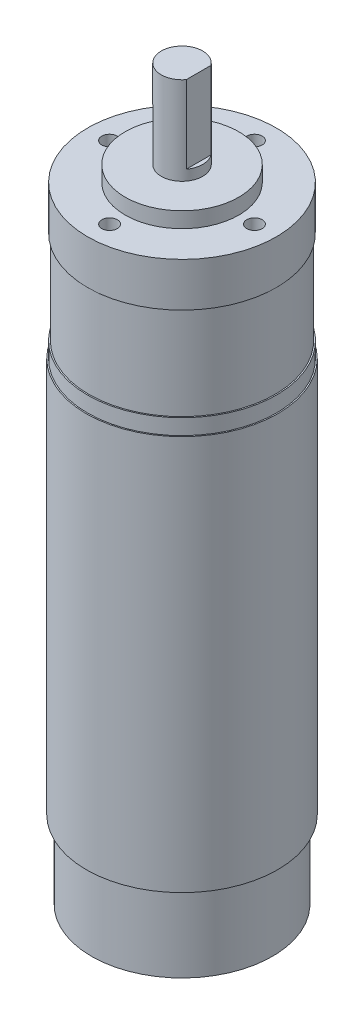
ISO-10303-21;
HEADER;
FILE_DESCRIPTION(('STEP AP214'),'2;1');
FILE_NAME('part.step','',(''),(''),'','','');
FILE_SCHEMA(('AUTOMOTIVE_DESIGN { 1 0 10303 214 1 1 1 1 }'));
ENDSEC;
DATA;
#1=APPLICATION_CONTEXT('core data for automotive mechanical design processes');
#2=APPLICATION_PROTOCOL_DEFINITION('international standard','automotive_design',2000,#1);
#3=PRODUCT_CONTEXT('',#1,'mechanical');
#4=PRODUCT('Part','Part','',(#3));
#5=PRODUCT_RELATED_PRODUCT_CATEGORY('part','',(#4));
#6=PRODUCT_DEFINITION_FORMATION('','',#4);
#7=PRODUCT_DEFINITION_CONTEXT('part definition',#1,'design');
#8=PRODUCT_DEFINITION('design','',#6,#7);
#9=PRODUCT_DEFINITION_SHAPE('','',#8);
#10=(LENGTH_UNIT() NAMED_UNIT(*) SI_UNIT(.MILLI.,.METRE.));
#11=(NAMED_UNIT(*) PLANE_ANGLE_UNIT() SI_UNIT($,.RADIAN.));
#12=(NAMED_UNIT(*) SI_UNIT($,.STERADIAN.) SOLID_ANGLE_UNIT());
#13=UNCERTAINTY_MEASURE_WITH_UNIT(LENGTH_MEASURE(1.E-05),#10,'distance_accuracy_value','');
#14=(GEOMETRIC_REPRESENTATION_CONTEXT(3) GLOBAL_UNCERTAINTY_ASSIGNED_CONTEXT((#13)) GLOBAL_UNIT_ASSIGNED_CONTEXT((#10,
#11,#12)) REPRESENTATION_CONTEXT('',''));
#15=CARTESIAN_POINT('',(0.,0.,0.));
#16=DIRECTION('',(0.,0.,1.));
#17=DIRECTION('',(1.,0.,0.));
#18=AXIS2_PLACEMENT_3D('',#15,#16,#17);
#19=CARTESIAN_POINT('',(0.,123.839,0.));
#20=DIRECTION('',(0.,1.,0.));
#21=DIRECTION('',(0.,0.,1.));
#22=AXIS2_PLACEMENT_3D('',#19,#20,#21);
#23=PLANE('',#22);
#24=CARTESIAN_POINT('',(0.,123.839,0.));
#25=DIRECTION('',(0.,1.,0.));
#26=DIRECTION('',(0.,0.,1.));
#27=AXIS2_PLACEMENT_3D('',#24,#25,#26);
#28=CIRCLE('',#27,10.977);
#29=CARTESIAN_POINT('',(0.,123.839,10.977));
#30=VERTEX_POINT('',#29);
#31=EDGE_CURVE('E74',#30,#30,#28,.T.);
#32=ORIENTED_EDGE('',*,*,#31,.T.);
#33=EDGE_LOOP('',(#32));
#34=FACE_BOUND('',#33,.T.);
#35=CARTESIAN_POINT('',(0.,123.839,0.));
#36=DIRECTION('',(0.,1.,0.));
#37=DIRECTION('',(0.,0.,1.));
#38=AXIS2_PLACEMENT_3D('',#35,#36,#37);
#39=CIRCLE('',#38,4.);
#40=CARTESIAN_POINT('',(0.,123.839,4.));
#41=VERTEX_POINT('',#40);
#42=EDGE_CURVE('E71',#41,#41,#39,.T.);
#43=ORIENTED_EDGE('',*,*,#42,.F.);
#44=EDGE_LOOP('',(#43));
#45=FACE_BOUND('',#44,.T.);
#46=ADVANCED_FACE('F32',(#34,#45),#23,.T.);
#47=CARTESIAN_POINT('',(0.,120.839,0.));
#48=DIRECTION('',(0.,1.,0.));
#49=DIRECTION('',(0.,0.,1.));
#50=AXIS2_PLACEMENT_3D('',#47,#48,#49);
#51=PLANE('',#50);
#52=CARTESIAN_POINT('',(-13.9989999999998,120.839,0.00100000000004344));
#53=DIRECTION('',(0.,1.,0.));
#54=DIRECTION('',(0.,0.,1.));
#55=AXIS2_PLACEMENT_3D('',#52,#53,#54);
#56=CIRCLE('',#55,1.5);
#57=CARTESIAN_POINT('',(-13.9989999999998,120.839,1.50100000000004));
#58=VERTEX_POINT('',#57);
#59=EDGE_CURVE('E365',#58,#58,#56,.T.);
#60=ORIENTED_EDGE('',*,*,#59,.F.);
#61=EDGE_LOOP('',(#60));
#62=FACE_BOUND('',#61,.T.);
#63=CARTESIAN_POINT('',(0.00200000000028109,120.839,14.));
#64=DIRECTION('',(0.,1.,0.));
#65=DIRECTION('',(0.,0.,1.));
#66=AXIS2_PLACEMENT_3D('',#63,#64,#65);
#67=CIRCLE('',#66,1.5);
#68=CARTESIAN_POINT('',(0.00200000000028109,120.839,15.5));
#69=VERTEX_POINT('',#68);
#70=EDGE_CURVE('E364',#69,#69,#67,.T.);
#71=ORIENTED_EDGE('',*,*,#70,.F.);
#72=EDGE_LOOP('',(#71));
#73=FACE_BOUND('',#72,.T.);
#74=CARTESIAN_POINT('',(14.0010000000002,120.839,-0.00100000000013947));
#75=DIRECTION('',(0.,1.,0.));
#76=DIRECTION('',(0.,0.,1.));
#77=AXIS2_PLACEMENT_3D('',#74,#75,#76);
#78=CIRCLE('',#77,1.5);
#79=CARTESIAN_POINT('',(14.0010000000002,120.839,1.49899999999986));
#80=VERTEX_POINT('',#79);
#81=EDGE_CURVE('E374',#80,#80,#78,.T.);
#82=ORIENTED_EDGE('',*,*,#81,.F.);
#83=EDGE_LOOP('',(#82));
#84=FACE_BOUND('',#83,.T.);
#85=CARTESIAN_POINT('',(0.,120.839,-14.));
#86=DIRECTION('',(0.,1.,0.));
#87=DIRECTION('',(0.,0.,1.));
#88=AXIS2_PLACEMENT_3D('',#85,#86,#87);
#89=CIRCLE('',#88,1.5);
#90=CARTESIAN_POINT('',(0.,120.839,-12.5));
#91=VERTEX_POINT('',#90);
#92=EDGE_CURVE('E379',#91,#91,#89,.T.);
#93=ORIENTED_EDGE('',*,*,#92,.F.);
#94=EDGE_LOOP('',(#93));
#95=FACE_BOUND('',#94,.T.);
#96=CARTESIAN_POINT('',(0.,120.839,0.));
#97=DIRECTION('',(0.,1.,0.));
#98=DIRECTION('',(0.,0.,1.));
#99=AXIS2_PLACEMENT_3D('',#96,#97,#98);
#100=CIRCLE('',#99,18.241);
#101=CARTESIAN_POINT('',(0.,120.839,18.241));
#102=VERTEX_POINT('',#101);
#103=EDGE_CURVE('E83',#102,#102,#100,.T.);
#104=ORIENTED_EDGE('',*,*,#103,.T.);
#105=EDGE_LOOP('',(#104));
#106=FACE_BOUND('',#105,.T.);
#107=CARTESIAN_POINT('',(0.,120.839,0.));
#108=DIRECTION('',(0.,1.,0.));
#109=DIRECTION('',(0.,0.,1.));
#110=AXIS2_PLACEMENT_3D('',#107,#108,#109);
#111=CIRCLE('',#110,10.977);
#112=CARTESIAN_POINT('',(0.,120.839,10.977));
#113=VERTEX_POINT('',#112);
#114=EDGE_CURVE('E70',#113,#113,#111,.T.);
#115=ORIENTED_EDGE('',*,*,#114,.F.);
#116=EDGE_LOOP('',(#115));
#117=FACE_BOUND('',#116,.T.);
#118=ADVANCED_FACE('F127',(#62,#73,#84,#95,#106,#117),#51,.T.);
#119=CARTESIAN_POINT('',(0.,94.339,0.));
#120=DIRECTION('',(0.,1.,0.));
#121=DIRECTION('',(0.,0.,1.));
#122=AXIS2_PLACEMENT_3D('',#119,#120,#121);
#123=PLANE('',#122);
#124=CARTESIAN_POINT('',(0.,94.339,0.));
#125=DIRECTION('',(0.,1.,0.));
#126=DIRECTION('',(0.,0.,1.));
#127=AXIS2_PLACEMENT_3D('',#124,#125,#126);
#128=CIRCLE('',#127,18.25);
#129=CARTESIAN_POINT('',(0.,94.339,18.25));
#130=VERTEX_POINT('',#129);
#131=EDGE_CURVE('E95',#130,#130,#128,.T.);
#132=ORIENTED_EDGE('',*,*,#131,.T.);
#133=EDGE_LOOP('',(#132));
#134=FACE_BOUND('',#133,.T.);
#135=CARTESIAN_POINT('',(0.,94.339,0.));
#136=DIRECTION('',(0.,1.,0.));
#137=DIRECTION('',(0.,0.,1.));
#138=AXIS2_PLACEMENT_3D('',#135,#136,#137);
#139=CIRCLE('',#138,18.);
#140=CARTESIAN_POINT('',(0.,94.339,18.));
#141=VERTEX_POINT('',#140);
#142=EDGE_CURVE('E86',#141,#141,#139,.T.);
#143=ORIENTED_EDGE('',*,*,#142,.F.);
#144=EDGE_LOOP('',(#143));
#145=FACE_BOUND('',#144,.T.);
#146=ADVANCED_FACE('F133',(#134,#145),#123,.T.);
#147=CARTESIAN_POINT('',(0.,91.339,0.));
#148=DIRECTION('',(0.,1.,0.));
#149=DIRECTION('',(0.,0.,1.));
#150=AXIS2_PLACEMENT_3D('',#147,#148,#149);
#151=PLANE('',#150);
#152=CARTESIAN_POINT('',(0.,91.339,0.));
#153=DIRECTION('',(0.,1.,0.));
#154=DIRECTION('',(0.,0.,1.));
#155=AXIS2_PLACEMENT_3D('',#152,#153,#154);
#156=CIRCLE('',#155,18.491);
#157=CARTESIAN_POINT('',(0.,91.339,18.491));
#158=VERTEX_POINT('',#157);
#159=EDGE_CURVE('E101',#158,#158,#156,.T.);
#160=ORIENTED_EDGE('',*,*,#159,.T.);
#161=EDGE_LOOP('',(#160));
#162=FACE_BOUND('',#161,.T.);
#163=CARTESIAN_POINT('',(0.,91.339,0.));
#164=DIRECTION('',(0.,1.,0.));
#165=DIRECTION('',(0.,0.,1.));
#166=AXIS2_PLACEMENT_3D('',#163,#164,#165);
#167=CIRCLE('',#166,18.25);
#168=CARTESIAN_POINT('',(0.,91.339,18.25));
#169=VERTEX_POINT('',#168);
#170=EDGE_CURVE('E92',#169,#169,#167,.T.);
#171=ORIENTED_EDGE('',*,*,#170,.F.);
#172=EDGE_LOOP('',(#171));
#173=FACE_BOUND('',#172,.T.);
#174=ADVANCED_FACE('F123',(#162,#173),#151,.T.);
#175=CARTESIAN_POINT('',(0.,15.,0.));
#176=DIRECTION('',(0.,-1.,0.));
#177=DIRECTION('',(0.,0.,-1.));
#178=AXIS2_PLACEMENT_3D('',#175,#176,#177);
#179=CYLINDRICAL_SURFACE('',#178,17.492);
#180=CARTESIAN_POINT('',(0.,15.,0.));
#181=DIRECTION('',(0.,1.,0.));
#182=DIRECTION('',(0.,0.,1.));
#183=AXIS2_PLACEMENT_3D('',#180,#181,#182);
#184=CIRCLE('',#183,17.492);
#185=CARTESIAN_POINT('',(0.,15.,17.492));
#186=VERTEX_POINT('',#185);
#187=EDGE_CURVE('E62',#186,#186,#184,.T.);
#188=ORIENTED_EDGE('',*,*,#187,.F.);
#189=EDGE_LOOP('',(#188));
#190=FACE_BOUND('',#189,.T.);
#191=CARTESIAN_POINT('',(0.,0.,0.));
#192=DIRECTION('',(0.,1.,0.));
#193=DIRECTION('',(0.,0.,1.));
#194=AXIS2_PLACEMENT_3D('',#191,#192,#193);
#195=CIRCLE('',#194,17.492);
#196=CARTESIAN_POINT('',(0.,0.,17.492));
#197=VERTEX_POINT('',#196);
#198=EDGE_CURVE('E104',#197,#197,#195,.T.);
#199=ORIENTED_EDGE('',*,*,#198,.T.);
#200=EDGE_LOOP('',(#199));
#201=FACE_BOUND('',#200,.T.);
#202=ADVANCED_FACE('F34',(#190,#201),#179,.T.);
#203=CARTESIAN_POINT('',(0.,0.,0.));
#204=DIRECTION('',(0.,1.,0.));
#205=DIRECTION('',(0.,0.,1.));
#206=AXIS2_PLACEMENT_3D('',#203,#204,#205);
#207=PLANE('',#206);
#208=ORIENTED_EDGE('',*,*,#198,.F.);
#209=EDGE_LOOP('',(#208));
#210=FACE_BOUND('',#209,.T.);
#211=ADVANCED_FACE('F113',(#210),#207,.F.);
#212=CARTESIAN_POINT('',(0.,15.,0.));
#213=DIRECTION('',(0.,1.,0.));
#214=DIRECTION('',(0.,0.,1.));
#215=AXIS2_PLACEMENT_3D('',#212,#213,#214);
#216=PLANE('',#215);
#217=CARTESIAN_POINT('',(0.,15.,0.));
#218=DIRECTION('',(0.,1.,0.));
#219=DIRECTION('',(0.,0.,1.));
#220=AXIS2_PLACEMENT_3D('',#217,#218,#219);
#221=CIRCLE('',#220,18.491);
#222=CARTESIAN_POINT('',(0.,15.,18.491));
#223=VERTEX_POINT('',#222);
#224=EDGE_CURVE('E98',#223,#223,#221,.T.);
#225=ORIENTED_EDGE('',*,*,#224,.F.);
#226=EDGE_LOOP('',(#225));
#227=FACE_BOUND('',#226,.T.);
#228=ORIENTED_EDGE('',*,*,#187,.T.);
#229=EDGE_LOOP('',(#228));
#230=FACE_BOUND('',#229,.T.);
#231=ADVANCED_FACE('F115',(#227,#230),#216,.F.);
#232=CARTESIAN_POINT('',(0.,91.339,0.));
#233=DIRECTION('',(0.,-1.,0.));
#234=DIRECTION('',(0.,0.,-1.));
#235=AXIS2_PLACEMENT_3D('',#232,#233,#234);
#236=CYLINDRICAL_SURFACE('',#235,18.491);
#237=ORIENTED_EDGE('',*,*,#159,.F.);
#238=EDGE_LOOP('',(#237));
#239=FACE_BOUND('',#238,.T.);
#240=ORIENTED_EDGE('',*,*,#224,.T.);
#241=EDGE_LOOP('',(#240));
#242=FACE_BOUND('',#241,.T.);
#243=ADVANCED_FACE('F120',(#239,#242),#236,.T.);
#244=CARTESIAN_POINT('',(0.,94.339,0.));
#245=DIRECTION('',(0.,-1.,0.));
#246=DIRECTION('',(0.,0.,-1.));
#247=AXIS2_PLACEMENT_3D('',#244,#245,#246);
#248=CYLINDRICAL_SURFACE('',#247,18.25);
#249=ORIENTED_EDGE('',*,*,#131,.F.);
#250=EDGE_LOOP('',(#249));
#251=FACE_BOUND('',#250,.T.);
#252=ORIENTED_EDGE('',*,*,#170,.T.);
#253=EDGE_LOOP('',(#252));
#254=FACE_BOUND('',#253,.T.);
#255=ADVANCED_FACE('F155',(#251,#254),#248,.T.);
#256=CARTESIAN_POINT('',(0.,112.339,0.));
#257=DIRECTION('',(0.,-1.,0.));
#258=DIRECTION('',(0.,0.,-1.));
#259=AXIS2_PLACEMENT_3D('',#256,#257,#258);
#260=CYLINDRICAL_SURFACE('',#259,18.);
#261=CARTESIAN_POINT('',(0.,112.339,0.));
#262=DIRECTION('',(0.,1.,0.));
#263=DIRECTION('',(0.,0.,1.));
#264=AXIS2_PLACEMENT_3D('',#261,#262,#263);
#265=CIRCLE('',#264,18.);
#266=CARTESIAN_POINT('',(0.,112.339,18.));
#267=VERTEX_POINT('',#266);
#268=EDGE_CURVE('E89',#267,#267,#265,.T.);
#269=ORIENTED_EDGE('',*,*,#268,.F.);
#270=EDGE_LOOP('',(#269));
#271=FACE_BOUND('',#270,.T.);
#272=ORIENTED_EDGE('',*,*,#142,.T.);
#273=EDGE_LOOP('',(#272));
#274=FACE_BOUND('',#273,.T.);
#275=ADVANCED_FACE('F148',(#271,#274),#260,.T.);
#276=CARTESIAN_POINT('',(0.,112.339,0.));
#277=DIRECTION('',(0.,1.,0.));
#278=DIRECTION('',(0.,0.,1.));
#279=AXIS2_PLACEMENT_3D('',#276,#277,#278);
#280=PLANE('',#279);
#281=CARTESIAN_POINT('',(0.,112.339,0.));
#282=DIRECTION('',(0.,1.,0.));
#283=DIRECTION('',(0.,0.,1.));
#284=AXIS2_PLACEMENT_3D('',#281,#282,#283);
#285=CIRCLE('',#284,18.241);
#286=CARTESIAN_POINT('',(0.,112.339,18.241));
#287=VERTEX_POINT('',#286);
#288=EDGE_CURVE('E81',#287,#287,#285,.T.);
#289=ORIENTED_EDGE('',*,*,#288,.F.);
#290=EDGE_LOOP('',(#289));
#291=FACE_BOUND('',#290,.T.);
#292=ORIENTED_EDGE('',*,*,#268,.T.);
#293=EDGE_LOOP('',(#292));
#294=FACE_BOUND('',#293,.T.);
#295=ADVANCED_FACE('F145',(#291,#294),#280,.F.);
#296=CARTESIAN_POINT('',(0.,120.839,0.));
#297=DIRECTION('',(0.,-1.,0.));
#298=DIRECTION('',(0.,0.,-1.));
#299=AXIS2_PLACEMENT_3D('',#296,#297,#298);
#300=CYLINDRICAL_SURFACE('',#299,18.241);
#301=ORIENTED_EDGE('',*,*,#103,.F.);
#302=EDGE_LOOP('',(#301));
#303=FACE_BOUND('',#302,.T.);
#304=ORIENTED_EDGE('',*,*,#288,.T.);
#305=EDGE_LOOP('',(#304));
#306=FACE_BOUND('',#305,.T.);
#307=ADVANCED_FACE('F142',(#303,#306),#300,.T.);
#308=CARTESIAN_POINT('',(0.,123.839,0.));
#309=DIRECTION('',(0.,-1.,0.));
#310=DIRECTION('',(0.,0.,-1.));
#311=AXIS2_PLACEMENT_3D('',#308,#309,#310);
#312=CYLINDRICAL_SURFACE('',#311,10.977);
#313=ORIENTED_EDGE('',*,*,#31,.F.);
#314=EDGE_LOOP('',(#313));
#315=FACE_BOUND('',#314,.T.);
#316=ORIENTED_EDGE('',*,*,#114,.T.);
#317=EDGE_LOOP('',(#316));
#318=FACE_BOUND('',#317,.T.);
#319=ADVANCED_FACE('F140',(#315,#318),#312,.T.);
#320=CARTESIAN_POINT('',(0.,140.839,0.));
#321=DIRECTION('',(0.,-1.,0.));
#322=DIRECTION('',(0.,0.,-1.));
#323=AXIS2_PLACEMENT_3D('',#320,#321,#322);
#324=CYLINDRICAL_SURFACE('',#323,4.);
#325=CARTESIAN_POINT('',(0.,140.839,0.));
#326=DIRECTION('',(0.,1.,0.));
#327=DIRECTION('',(0.,0.,1.));
#328=AXIS2_PLACEMENT_3D('',#325,#326,#327);
#329=CIRCLE('',#328,4.);
#330=CARTESIAN_POINT('',(3.212,140.839,-2.38391610590641));
#331=VERTEX_POINT('',#330);
#332=CARTESIAN_POINT('',(3.212,140.839,2.38391610590641));
#333=VERTEX_POINT('',#332);
#334=EDGE_CURVE('E66',#331,#333,#329,.T.);
#335=ORIENTED_EDGE('',*,*,#334,.F.);
#336=DIRECTION('',(0.,-1.,0.));
#337=VECTOR('',#336,1.);
#338=CARTESIAN_POINT('',(3.212,140.839,-2.38391610590641));
#339=LINE('',#338,#337);
#340=CARTESIAN_POINT('',(3.212,125.839,-2.38391610590641));
#341=VERTEX_POINT('',#340);
#342=EDGE_CURVE('E47',#331,#341,#339,.T.);
#343=ORIENTED_EDGE('',*,*,#342,.T.);
#344=CARTESIAN_POINT('',(0.,125.839,0.));
#345=DIRECTION('',(0.,-1.,0.));
#346=DIRECTION('',(0.,0.,-1.));
#347=AXIS2_PLACEMENT_3D('',#344,#345,#346);
#348=CIRCLE('',#347,4.);
#349=CARTESIAN_POINT('',(3.212,125.839,2.38391610590641));
#350=VERTEX_POINT('',#349);
#351=EDGE_CURVE('E11',#341,#350,#348,.T.);
#352=ORIENTED_EDGE('',*,*,#351,.T.);
#353=DIRECTION('',(0.,-1.,0.));
#354=VECTOR('',#353,1.);
#355=CARTESIAN_POINT('',(3.212,140.839,2.38391610590641));
#356=LINE('',#355,#354);
#357=EDGE_CURVE('E52',#350,#333,#356,.F.);
#358=ORIENTED_EDGE('',*,*,#357,.T.);
#359=EDGE_LOOP('',(#335,#343,#352,#358));
#360=FACE_BOUND('',#359,.T.);
#361=ORIENTED_EDGE('',*,*,#42,.T.);
#362=EDGE_LOOP('',(#361));
#363=FACE_BOUND('',#362,.T.);
#364=ADVANCED_FACE('F64',(#360,#363),#324,.T.);
#365=CARTESIAN_POINT('',(0.,140.839,0.));
#366=DIRECTION('',(0.,1.,0.));
#367=DIRECTION('',(0.,0.,1.));
#368=AXIS2_PLACEMENT_3D('',#365,#366,#367);
#369=PLANE('',#368);
#370=DIRECTION('',(0.,0.,1.));
#371=VECTOR('',#370,1.);
#372=CARTESIAN_POINT('',(3.212,140.839,0.));
#373=LINE('',#372,#371);
#374=EDGE_CURVE('E40',#331,#333,#373,.T.);
#375=ORIENTED_EDGE('',*,*,#374,.F.);
#376=ORIENTED_EDGE('',*,*,#334,.T.);
#377=EDGE_LOOP('',(#375,#376));
#378=FACE_BOUND('',#377,.T.);
#379=ADVANCED_FACE('F69',(#378),#369,.T.);
#380=CARTESIAN_POINT('',(5.90361291872839,125.839,7.29679439686475));
#381=DIRECTION('',(0.,-1.,0.));
#382=DIRECTION('',(0.,0.,-1.));
#383=AXIS2_PLACEMENT_3D('',#380,#381,#382);
#384=PLANE('',#383);
#385=DIRECTION('',(0.,0.,1.));
#386=VECTOR('',#385,1.);
#387=CARTESIAN_POINT('',(3.212,125.839,-5.23602825596431));
#388=LINE('',#387,#386);
#389=EDGE_CURVE('E67',#341,#350,#388,.T.);
#390=ORIENTED_EDGE('',*,*,#389,.T.);
#391=ORIENTED_EDGE('',*,*,#351,.F.);
#392=EDGE_LOOP('',(#390,#391));
#393=FACE_BOUND('',#392,.T.);
#394=ADVANCED_FACE('F212',(#393),#384,.F.);
#395=CARTESIAN_POINT('',(3.212,125.839,-5.23602825596431));
#396=DIRECTION('',(-1.,0.,0.));
#397=DIRECTION('',(0.,0.,1.));
#398=AXIS2_PLACEMENT_3D('',#395,#396,#397);
#399=PLANE('',#398);
#400=ORIENTED_EDGE('',*,*,#374,.T.);
#401=ORIENTED_EDGE('',*,*,#357,.F.);
#402=ORIENTED_EDGE('',*,*,#389,.F.);
#403=ORIENTED_EDGE('',*,*,#342,.F.);
#404=EDGE_LOOP('',(#400,#401,#402,#403));
#405=FACE_BOUND('',#404,.T.);
#406=ADVANCED_FACE('F58',(#405),#399,.F.);
#407=CARTESIAN_POINT('',(0.,113.839,-14.));
#408=DIRECTION('',(0.,1.,0.));
#409=DIRECTION('',(0.,0.,1.));
#410=AXIS2_PLACEMENT_3D('',#407,#408,#409);
#411=CYLINDRICAL_SURFACE('',#410,1.5);
#412=CARTESIAN_POINT('',(0.,113.839,-14.));
#413=DIRECTION('',(0.,1.,0.));
#414=DIRECTION('',(0.,0.,1.));
#415=AXIS2_PLACEMENT_3D('',#412,#413,#414);
#416=CIRCLE('',#415,1.5);
#417=CARTESIAN_POINT('',(0.,113.839,-12.5));
#418=VERTEX_POINT('',#417);
#419=EDGE_CURVE('E382',#418,#418,#416,.T.);
#420=ORIENTED_EDGE('',*,*,#419,.F.);
#421=EDGE_LOOP('',(#420));
#422=FACE_BOUND('',#421,.T.);
#423=ORIENTED_EDGE('',*,*,#92,.T.);
#424=EDGE_LOOP('',(#423));
#425=FACE_BOUND('',#424,.T.);
#426=ADVANCED_FACE('F225',(#422,#425),#411,.F.);
#427=CARTESIAN_POINT('',(0.,113.839,-14.));
#428=DIRECTION('',(0.,1.,0.));
#429=DIRECTION('',(0.,0.,1.));
#430=AXIS2_PLACEMENT_3D('',#427,#428,#429);
#431=PLANE('',#430);
#432=ORIENTED_EDGE('',*,*,#419,.T.);
#433=EDGE_LOOP('',(#432));
#434=FACE_BOUND('',#433,.T.);
#435=ADVANCED_FACE('F233',(#434),#431,.T.);
#436=CARTESIAN_POINT('',(14.0010000000002,113.839,-0.00100000000013947));
#437=DIRECTION('',(0.,1.,0.));
#438=DIRECTION('',(0.,0.,1.));
#439=AXIS2_PLACEMENT_3D('',#436,#437,#438);
#440=CYLINDRICAL_SURFACE('',#439,1.5);
#441=CARTESIAN_POINT('',(14.0010000000002,113.839,-0.00100000000013947));
#442=DIRECTION('',(0.,1.,0.));
#443=DIRECTION('',(0.,0.,1.));
#444=AXIS2_PLACEMENT_3D('',#441,#442,#443);
#445=CIRCLE('',#444,1.5);
#446=CARTESIAN_POINT('',(14.0010000000002,113.839,1.49899999999986));
#447=VERTEX_POINT('',#446);
#448=EDGE_CURVE('E376',#447,#447,#445,.T.);
#449=ORIENTED_EDGE('',*,*,#448,.F.);
#450=EDGE_LOOP('',(#449));
#451=FACE_BOUND('',#450,.T.);
#452=ORIENTED_EDGE('',*,*,#81,.T.);
#453=EDGE_LOOP('',(#452));
#454=FACE_BOUND('',#453,.T.);
#455=ADVANCED_FACE('F241',(#451,#454),#440,.F.);
#456=CARTESIAN_POINT('',(14.0010000000002,113.839,-0.00100000000013947));
#457=DIRECTION('',(0.,1.,0.));
#458=DIRECTION('',(0.,0.,1.));
#459=AXIS2_PLACEMENT_3D('',#456,#457,#458);
#460=PLANE('',#459);
#461=ORIENTED_EDGE('',*,*,#448,.T.);
#462=EDGE_LOOP('',(#461));
#463=FACE_BOUND('',#462,.T.);
#464=ADVANCED_FACE('F249',(#463),#460,.T.);
#465=CARTESIAN_POINT('',(0.00200000000028109,113.839,14.));
#466=DIRECTION('',(0.,1.,0.));
#467=DIRECTION('',(0.,0.,1.));
#468=AXIS2_PLACEMENT_3D('',#465,#466,#467);
#469=CYLINDRICAL_SURFACE('',#468,1.5);
#470=CARTESIAN_POINT('',(0.00200000000028109,113.839,14.));
#471=DIRECTION('',(0.,1.,0.));
#472=DIRECTION('',(0.,0.,1.));
#473=AXIS2_PLACEMENT_3D('',#470,#471,#472);
#474=CIRCLE('',#473,1.5);
#475=CARTESIAN_POINT('',(0.00200000000028109,113.839,15.5));
#476=VERTEX_POINT('',#475);
#477=EDGE_CURVE('E368',#476,#476,#474,.T.);
#478=ORIENTED_EDGE('',*,*,#477,.F.);
#479=EDGE_LOOP('',(#478));
#480=FACE_BOUND('',#479,.T.);
#481=ORIENTED_EDGE('',*,*,#70,.T.);
#482=EDGE_LOOP('',(#481));
#483=FACE_BOUND('',#482,.T.);
#484=ADVANCED_FACE('F257',(#480,#483),#469,.F.);
#485=CARTESIAN_POINT('',(0.00200000000028109,113.839,14.));
#486=DIRECTION('',(0.,1.,0.));
#487=DIRECTION('',(0.,0.,1.));
#488=AXIS2_PLACEMENT_3D('',#485,#486,#487);
#489=PLANE('',#488);
#490=ORIENTED_EDGE('',*,*,#477,.T.);
#491=EDGE_LOOP('',(#490));
#492=FACE_BOUND('',#491,.T.);
#493=ADVANCED_FACE('F265',(#492),#489,.T.);
#494=CARTESIAN_POINT('',(-13.9989999999998,113.839,0.00100000000004344));
#495=DIRECTION('',(0.,1.,0.));
#496=DIRECTION('',(0.,0.,1.));
#497=AXIS2_PLACEMENT_3D('',#494,#495,#496);
#498=CYLINDRICAL_SURFACE('',#497,1.5);
#499=CARTESIAN_POINT('',(-13.9989999999998,113.839,0.00100000000004344));
#500=DIRECTION('',(0.,1.,0.));
#501=DIRECTION('',(0.,0.,1.));
#502=AXIS2_PLACEMENT_3D('',#499,#500,#501);
#503=CIRCLE('',#502,1.5);
#504=CARTESIAN_POINT('',(-13.9989999999998,113.839,1.50100000000004));
#505=VERTEX_POINT('',#504);
#506=EDGE_CURVE('E363',#505,#505,#503,.T.);
#507=ORIENTED_EDGE('',*,*,#506,.F.);
#508=EDGE_LOOP('',(#507));
#509=FACE_BOUND('',#508,.T.);
#510=ORIENTED_EDGE('',*,*,#59,.T.);
#511=EDGE_LOOP('',(#510));
#512=FACE_BOUND('',#511,.T.);
#513=ADVANCED_FACE('F273',(#509,#512),#498,.F.);
#514=CARTESIAN_POINT('',(-13.9989999999998,113.839,0.00100000000004344));
#515=DIRECTION('',(0.,1.,0.));
#516=DIRECTION('',(0.,0.,1.));
#517=AXIS2_PLACEMENT_3D('',#514,#515,#516);
#518=PLANE('',#517);
#519=ORIENTED_EDGE('',*,*,#506,.T.);
#520=EDGE_LOOP('',(#519));
#521=FACE_BOUND('',#520,.T.);
#522=ADVANCED_FACE('F281',(#521),#518,.T.);
#523=CLOSED_SHELL('',(#46,#118,#146,#174,#202,#211,#231,#243,#255,#275,#295,#307,#319,#364,#379,
#394,#406,#426,#435,#455,#464,#484,#493,#513,#522));
#524=MANIFOLD_SOLID_BREP('B2',#523);
#525=ADVANCED_BREP_SHAPE_REPRESENTATION('',(#18,#524),#14);
#526=SHAPE_DEFINITION_REPRESENTATION(#9,#525);
ENDSEC;
END-ISO-10303-21;
